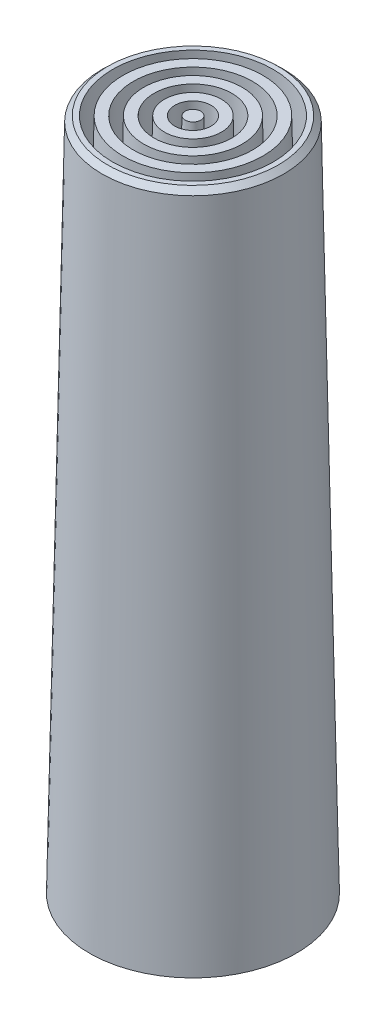
ISO-10303-21;
HEADER;
FILE_DESCRIPTION(('STEP AP214'),'2;1');
FILE_NAME('part.step','',(''),(''),'','','');
FILE_SCHEMA(('AUTOMOTIVE_DESIGN { 1 0 10303 214 1 1 1 1 }'));
ENDSEC;
DATA;
#1=APPLICATION_CONTEXT('core data for automotive mechanical design processes');
#2=APPLICATION_PROTOCOL_DEFINITION('international standard','automotive_design',2000,#1);
#3=PRODUCT_CONTEXT('',#1,'mechanical');
#4=PRODUCT('Part','Part','',(#3));
#5=PRODUCT_RELATED_PRODUCT_CATEGORY('part','',(#4));
#6=PRODUCT_DEFINITION_FORMATION('','',#4);
#7=PRODUCT_DEFINITION_CONTEXT('part definition',#1,'design');
#8=PRODUCT_DEFINITION('design','',#6,#7);
#9=PRODUCT_DEFINITION_SHAPE('','',#8);
#10=(LENGTH_UNIT() NAMED_UNIT(*) SI_UNIT(.MILLI.,.METRE.));
#11=(NAMED_UNIT(*) PLANE_ANGLE_UNIT() SI_UNIT($,.RADIAN.));
#12=(NAMED_UNIT(*) SI_UNIT($,.STERADIAN.) SOLID_ANGLE_UNIT());
#13=UNCERTAINTY_MEASURE_WITH_UNIT(LENGTH_MEASURE(1.E-05),#10,'distance_accuracy_value','');
#14=(GEOMETRIC_REPRESENTATION_CONTEXT(3) GLOBAL_UNCERTAINTY_ASSIGNED_CONTEXT((#13)) GLOBAL_UNIT_ASSIGNED_CONTEXT((#10,
#11,#12)) REPRESENTATION_CONTEXT('',''));
#15=CARTESIAN_POINT('',(0.,0.,0.));
#16=DIRECTION('',(0.,0.,1.));
#17=DIRECTION('',(1.,0.,0.));
#18=AXIS2_PLACEMENT_3D('',#15,#16,#17);
#19=CARTESIAN_POINT('',(0.,0.,0.));
#20=DIRECTION('',(0.,1.,0.));
#21=DIRECTION('',(-1.,0.,0.));
#22=AXIS2_PLACEMENT_3D('',#19,#20,#21);
#23=PLANE('',#22);
#24=CARTESIAN_POINT('',(0.,0.,0.));
#25=DIRECTION('',(0.,1.,0.));
#26=DIRECTION('',(-1.,0.,0.));
#27=AXIS2_PLACEMENT_3D('',#24,#25,#26);
#28=CIRCLE('',#27,20.);
#29=CARTESIAN_POINT('',(-20.,0.,0.));
#30=VERTEX_POINT('',#29);
#31=EDGE_CURVE('E62',#30,#30,#28,.T.);
#32=ORIENTED_EDGE('',*,*,#31,.F.);
#33=EDGE_LOOP('',(#32));
#34=FACE_BOUND('',#33,.T.);
#35=CARTESIAN_POINT('',(0.,0.,0.));
#36=DIRECTION('',(0.,-1.,0.));
#37=DIRECTION('',(1.,0.,0.));
#38=AXIS2_PLACEMENT_3D('',#35,#36,#37);
#39=CIRCLE('',#38,17.9996302117006);
#40=CARTESIAN_POINT('',(17.9996302117006,0.,0.));
#41=VERTEX_POINT('',#40);
#42=EDGE_CURVE('E58',#41,#41,#39,.T.);
#43=ORIENTED_EDGE('',*,*,#42,.F.);
#44=EDGE_LOOP('',(#43));
#45=FACE_BOUND('',#44,.T.);
#46=ADVANCED_FACE('F46',(#34,#45),#23,.F.);
#47=CARTESIAN_POINT('',(17.5,130.,0.));
#48=DIRECTION('',(0.,-1.,0.));
#49=DIRECTION('',(1.,0.,0.));
#50=AXIS2_PLACEMENT_3D('',#47,#48,#49);
#51=PLANE('',#50);
#52=CARTESIAN_POINT('',(0.,130.,0.));
#53=DIRECTION('',(0.,-1.,0.));
#54=DIRECTION('',(1.,0.,0.));
#55=AXIS2_PLACEMENT_3D('',#52,#53,#54);
#56=CIRCLE('',#55,16.4802036373375);
#57=CARTESIAN_POINT('',(16.4802036373375,130.,0.));
#58=VERTEX_POINT('',#57);
#59=EDGE_CURVE('E54',#58,#58,#56,.F.);
#60=ORIENTED_EDGE('',*,*,#59,.T.);
#61=EDGE_LOOP('',(#60));
#62=FACE_BOUND('',#61,.T.);
#63=CARTESIAN_POINT('',(0.,130.,0.));
#64=DIRECTION('',(0.,-1.,0.));
#65=DIRECTION('',(1.,0.,0.));
#66=AXIS2_PLACEMENT_3D('',#63,#64,#65);
#67=CIRCLE('',#66,15.4996302117006);
#68=CARTESIAN_POINT('',(15.4996302117006,130.,0.));
#69=VERTEX_POINT('',#68);
#70=EDGE_CURVE('E65',#69,#69,#67,.T.);
#71=ORIENTED_EDGE('',*,*,#70,.T.);
#72=EDGE_LOOP('',(#71));
#73=FACE_BOUND('',#72,.T.);
#74=ADVANCED_FACE('F75',(#62,#73),#51,.F.);
#75=CARTESIAN_POINT('',(0.,0.,0.));
#76=DIRECTION('',(0.,-1.,0.));
#77=DIRECTION('',(1.,0.,0.));
#78=AXIS2_PLACEMENT_3D('',#75,#76,#77);
#79=CONICAL_SURFACE('',#78,20.,0.0192283990997072);
#80=CARTESIAN_POINT('',(0.,129.00018485997,0.));
#81=DIRECTION('',(0.,1.,0.));
#82=DIRECTION('',(-1.,0.,0.));
#83=AXIS2_PLACEMENT_3D('',#80,#81,#82);
#84=CIRCLE('',#83,17.5192272142313);
#85=CARTESIAN_POINT('',(-17.5192272142313,129.00018485997,0.));
#86=VERTEX_POINT('',#85);
#87=EDGE_CURVE('E11',#86,#86,#84,.F.);
#88=ORIENTED_EDGE('',*,*,#87,.T.);
#89=EDGE_LOOP('',(#88));
#90=FACE_BOUND('',#89,.T.);
#91=ORIENTED_EDGE('',*,*,#31,.T.);
#92=EDGE_LOOP('',(#91));
#93=FACE_BOUND('',#92,.T.);
#94=ADVANCED_FACE('F71',(#90,#93),#79,.T.);
#95=CARTESIAN_POINT('',(0.,0.,0.));
#96=DIRECTION('',(0.,-1.,0.));
#97=DIRECTION('',(1.,0.,0.));
#98=AXIS2_PLACEMENT_3D('',#95,#96,#97);
#99=CONICAL_SURFACE('',#98,17.9996302117006,0.0192283990997072);
#100=ORIENTED_EDGE('',*,*,#70,.F.);
#101=EDGE_LOOP('',(#100));
#102=FACE_BOUND('',#101,.T.);
#103=ORIENTED_EDGE('',*,*,#42,.T.);
#104=EDGE_LOOP('',(#103));
#105=FACE_BOUND('',#104,.T.);
#106=ADVANCED_FACE('F78',(#102,#105),#99,.F.);
#107=CARTESIAN_POINT('',(0.,130.,0.));
#108=DIRECTION('',(0.,-1.,0.));
#109=DIRECTION('',(1.,0.,0.));
#110=AXIS2_PLACEMENT_3D('',#107,#108,#109);
#111=CONICAL_SURFACE('',#110,16.4802036373375,0.804626562497172);
#112=ORIENTED_EDGE('',*,*,#87,.F.);
#113=EDGE_LOOP('',(#112));
#114=FACE_BOUND('',#113,.T.);
#115=ORIENTED_EDGE('',*,*,#59,.F.);
#116=EDGE_LOOP('',(#115));
#117=FACE_BOUND('',#116,.T.);
#118=ADVANCED_FACE('F49',(#114,#117),#111,.T.);
#119=CLOSED_SHELL('',(#46,#74,#94,#106,#118));
#120=MANIFOLD_SOLID_BREP('B2',#119);
#121=CARTESIAN_POINT('',(17.5,130.,0.));
#122=DIRECTION('',(0.,-1.,0.));
#123=DIRECTION('',(1.,0.,0.));
#124=AXIS2_PLACEMENT_3D('',#121,#122,#123);
#125=PLANE('',#124);
#126=CARTESIAN_POINT('',(0.,130.,0.));
#127=DIRECTION('',(0.,-1.,0.));
#128=DIRECTION('',(1.,0.,0.));
#129=AXIS2_PLACEMENT_3D('',#126,#127,#128);
#130=CIRCLE('',#129,13.4992604234013);
#131=CARTESIAN_POINT('',(13.4992604234013,130.,0.));
#132=VERTEX_POINT('',#131);
#133=EDGE_CURVE('E156',#132,#132,#130,.T.);
#134=ORIENTED_EDGE('',*,*,#133,.F.);
#135=EDGE_LOOP('',(#134));
#136=FACE_BOUND('',#135,.T.);
#137=CARTESIAN_POINT('',(0.,130.,0.));
#138=DIRECTION('',(0.,-1.,0.));
#139=DIRECTION('',(1.,0.,0.));
#140=AXIS2_PLACEMENT_3D('',#137,#138,#139);
#141=CIRCLE('',#140,11.4988906351019);
#142=CARTESIAN_POINT('',(11.4988906351019,130.,0.));
#143=VERTEX_POINT('',#142);
#144=EDGE_CURVE('E158',#143,#143,#141,.T.);
#145=ORIENTED_EDGE('',*,*,#144,.T.);
#146=EDGE_LOOP('',(#145));
#147=FACE_BOUND('',#146,.T.);
#148=ADVANCED_FACE('F144',(#136,#147),#125,.F.);
#149=CARTESIAN_POINT('',(0.,130.,0.));
#150=DIRECTION('',(0.,-1.,0.));
#151=DIRECTION('',(1.,0.,0.));
#152=AXIS2_PLACEMENT_3D('',#149,#150,#151);
#153=CONICAL_SURFACE('',#152,13.4992604234013,0.0192283990997072);
#154=CARTESIAN_POINT('',(0.,0.,0.));
#155=DIRECTION('',(0.,-1.,0.));
#156=DIRECTION('',(1.,0.,0.));
#157=AXIS2_PLACEMENT_3D('',#154,#155,#156);
#158=CIRCLE('',#157,15.9992604234013);
#159=CARTESIAN_POINT('',(15.9992604234013,0.,0.));
#160=VERTEX_POINT('',#159);
#161=EDGE_CURVE('E45',#160,#160,#158,.T.);
#162=ORIENTED_EDGE('',*,*,#161,.F.);
#163=EDGE_LOOP('',(#162));
#164=FACE_BOUND('',#163,.T.);
#165=ORIENTED_EDGE('',*,*,#133,.T.);
#166=EDGE_LOOP('',(#165));
#167=FACE_BOUND('',#166,.T.);
#168=ADVANCED_FACE('F165',(#164,#167),#153,.T.);
#169=CARTESIAN_POINT('',(0.,0.,0.));
#170=DIRECTION('',(0.,-1.,0.));
#171=DIRECTION('',(1.,0.,0.));
#172=AXIS2_PLACEMENT_3D('',#169,#170,#171);
#173=CONICAL_SURFACE('',#172,13.9988906351019,0.0192283990997072);
#174=ORIENTED_EDGE('',*,*,#144,.F.);
#175=EDGE_LOOP('',(#174));
#176=FACE_BOUND('',#175,.T.);
#177=CARTESIAN_POINT('',(0.,0.,0.));
#178=DIRECTION('',(0.,-1.,0.));
#179=DIRECTION('',(1.,0.,0.));
#180=AXIS2_PLACEMENT_3D('',#177,#178,#179);
#181=CIRCLE('',#180,13.9988906351019);
#182=CARTESIAN_POINT('',(13.9988906351019,0.,0.));
#183=VERTEX_POINT('',#182);
#184=EDGE_CURVE('E148',#183,#183,#181,.T.);
#185=ORIENTED_EDGE('',*,*,#184,.T.);
#186=EDGE_LOOP('',(#185));
#187=FACE_BOUND('',#186,.T.);
#188=ADVANCED_FACE('F171',(#176,#187),#173,.F.);
#189=CARTESIAN_POINT('',(0.,0.,0.));
#190=DIRECTION('',(0.,1.,0.));
#191=DIRECTION('',(-1.,0.,0.));
#192=AXIS2_PLACEMENT_3D('',#189,#190,#191);
#193=PLANE('',#192);
#194=ORIENTED_EDGE('',*,*,#161,.T.);
#195=EDGE_LOOP('',(#194));
#196=FACE_BOUND('',#195,.T.);
#197=ORIENTED_EDGE('',*,*,#184,.F.);
#198=EDGE_LOOP('',(#197));
#199=FACE_BOUND('',#198,.T.);
#200=ADVANCED_FACE('F146',(#196,#199),#193,.F.);
#201=CLOSED_SHELL('',(#148,#168,#188,#200));
#202=MANIFOLD_SOLID_BREP('B6',#201);
#203=CARTESIAN_POINT('',(17.5,130.,0.));
#204=DIRECTION('',(0.,-1.,0.));
#205=DIRECTION('',(1.,0.,0.));
#206=AXIS2_PLACEMENT_3D('',#203,#204,#205);
#207=PLANE('',#206);
#208=CARTESIAN_POINT('',(0.,130.,0.));
#209=DIRECTION('',(0.,-1.,0.));
#210=DIRECTION('',(1.,0.,0.));
#211=AXIS2_PLACEMENT_3D('',#208,#209,#210);
#212=CIRCLE('',#211,3.49741148190448);
#213=CARTESIAN_POINT('',(3.49741148190448,130.,0.));
#214=VERTEX_POINT('',#213);
#215=EDGE_CURVE('E236',#214,#214,#212,.T.);
#216=ORIENTED_EDGE('',*,*,#215,.T.);
#217=EDGE_LOOP('',(#216));
#218=FACE_BOUND('',#217,.T.);
#219=CARTESIAN_POINT('',(0.,130.,0.));
#220=DIRECTION('',(0.,-1.,0.));
#221=DIRECTION('',(1.,0.,0.));
#222=AXIS2_PLACEMENT_3D('',#219,#220,#221);
#223=CIRCLE('',#222,5.49778127020384);
#224=CARTESIAN_POINT('',(5.49778127020384,130.,0.));
#225=VERTEX_POINT('',#224);
#226=EDGE_CURVE('E230',#225,#225,#223,.T.);
#227=ORIENTED_EDGE('',*,*,#226,.F.);
#228=EDGE_LOOP('',(#227));
#229=FACE_BOUND('',#228,.T.);
#230=ADVANCED_FACE('F222',(#218,#229),#207,.F.);
#231=CARTESIAN_POINT('',(0.,0.,0.));
#232=DIRECTION('',(0.,-1.,0.));
#233=DIRECTION('',(1.,0.,0.));
#234=AXIS2_PLACEMENT_3D('',#231,#232,#233);
#235=CONICAL_SURFACE('',#234,5.99741148190448,0.0192283990997072);
#236=ORIENTED_EDGE('',*,*,#215,.F.);
#237=EDGE_LOOP('',(#236));
#238=FACE_BOUND('',#237,.T.);
#239=CARTESIAN_POINT('',(0.,0.,0.));
#240=DIRECTION('',(0.,-1.,0.));
#241=DIRECTION('',(1.,0.,0.));
#242=AXIS2_PLACEMENT_3D('',#239,#240,#241);
#243=CIRCLE('',#242,5.99741148190448);
#244=CARTESIAN_POINT('',(5.99741148190448,0.,0.));
#245=VERTEX_POINT('',#244);
#246=EDGE_CURVE('E226',#245,#245,#243,.T.);
#247=ORIENTED_EDGE('',*,*,#246,.T.);
#248=EDGE_LOOP('',(#247));
#249=FACE_BOUND('',#248,.T.);
#250=ADVANCED_FACE('F243',(#238,#249),#235,.F.);
#251=CARTESIAN_POINT('',(0.,130.,0.));
#252=DIRECTION('',(0.,-1.,0.));
#253=DIRECTION('',(1.,0.,0.));
#254=AXIS2_PLACEMENT_3D('',#251,#252,#253);
#255=CONICAL_SURFACE('',#254,5.49778127020384,0.0192283990997072);
#256=CARTESIAN_POINT('',(0.,0.,0.));
#257=DIRECTION('',(0.,-1.,0.));
#258=DIRECTION('',(1.,0.,0.));
#259=AXIS2_PLACEMENT_3D('',#256,#257,#258);
#260=CIRCLE('',#259,7.99778127020384);
#261=CARTESIAN_POINT('',(7.99778127020384,0.,0.));
#262=VERTEX_POINT('',#261);
#263=EDGE_CURVE('E143',#262,#262,#260,.T.);
#264=ORIENTED_EDGE('',*,*,#263,.F.);
#265=EDGE_LOOP('',(#264));
#266=FACE_BOUND('',#265,.T.);
#267=ORIENTED_EDGE('',*,*,#226,.T.);
#268=EDGE_LOOP('',(#267));
#269=FACE_BOUND('',#268,.T.);
#270=ADVANCED_FACE('F246',(#266,#269),#255,.T.);
#271=CARTESIAN_POINT('',(0.,0.,0.));
#272=DIRECTION('',(0.,1.,0.));
#273=DIRECTION('',(-1.,0.,0.));
#274=AXIS2_PLACEMENT_3D('',#271,#272,#273);
#275=PLANE('',#274);
#276=ORIENTED_EDGE('',*,*,#246,.F.);
#277=EDGE_LOOP('',(#276));
#278=FACE_BOUND('',#277,.T.);
#279=ORIENTED_EDGE('',*,*,#263,.T.);
#280=EDGE_LOOP('',(#279));
#281=FACE_BOUND('',#280,.T.);
#282=ADVANCED_FACE('F224',(#278,#281),#275,.F.);
#283=CLOSED_SHELL('',(#230,#250,#270,#282));
#284=MANIFOLD_SOLID_BREP('B40',#283);
#285=CARTESIAN_POINT('',(17.5,130.,0.));
#286=DIRECTION('',(0.,-1.,0.));
#287=DIRECTION('',(1.,0.,0.));
#288=AXIS2_PLACEMENT_3D('',#285,#286,#287);
#289=PLANE('',#288);
#290=CARTESIAN_POINT('',(0.,130.,0.));
#291=DIRECTION('',(0.,-1.,0.));
#292=DIRECTION('',(1.,0.,0.));
#293=AXIS2_PLACEMENT_3D('',#290,#291,#292);
#294=CIRCLE('',#293,1.49704169360513);
#295=CARTESIAN_POINT('',(1.49704169360512,130.,0.));
#296=VERTEX_POINT('',#295);
#297=EDGE_CURVE('E303',#296,#296,#294,.T.);
#298=ORIENTED_EDGE('',*,*,#297,.F.);
#299=EDGE_LOOP('',(#298));
#300=FACE_BOUND('',#299,.T.);
#301=ADVANCED_FACE('F299',(#300),#289,.F.);
#302=CARTESIAN_POINT('',(0.,130.,0.));
#303=DIRECTION('',(0.,-1.,0.));
#304=DIRECTION('',(1.,0.,0.));
#305=AXIS2_PLACEMENT_3D('',#302,#303,#304);
#306=CONICAL_SURFACE('',#305,1.49704169360513,0.0192283990997072);
#307=CARTESIAN_POINT('',(0.,0.,0.));
#308=DIRECTION('',(0.,-1.,0.));
#309=DIRECTION('',(1.,0.,0.));
#310=AXIS2_PLACEMENT_3D('',#307,#308,#309);
#311=CIRCLE('',#310,3.99704169360512);
#312=CARTESIAN_POINT('',(3.99704169360512,0.,0.));
#313=VERTEX_POINT('',#312);
#314=EDGE_CURVE('E221',#313,#313,#311,.T.);
#315=ORIENTED_EDGE('',*,*,#314,.F.);
#316=EDGE_LOOP('',(#315));
#317=FACE_BOUND('',#316,.T.);
#318=ORIENTED_EDGE('',*,*,#297,.T.);
#319=EDGE_LOOP('',(#318));
#320=FACE_BOUND('',#319,.T.);
#321=ADVANCED_FACE('F312',(#317,#320),#306,.T.);
#322=CARTESIAN_POINT('',(0.,0.,0.));
#323=DIRECTION('',(0.,1.,0.));
#324=DIRECTION('',(-1.,0.,0.));
#325=AXIS2_PLACEMENT_3D('',#322,#323,#324);
#326=PLANE('',#325);
#327=ORIENTED_EDGE('',*,*,#314,.T.);
#328=EDGE_LOOP('',(#327));
#329=FACE_BOUND('',#328,.T.);
#330=ADVANCED_FACE('F301',(#329),#326,.F.);
#331=CLOSED_SHELL('',(#301,#321,#330));
#332=MANIFOLD_SOLID_BREP('B138',#331);
#333=CARTESIAN_POINT('',(17.5,130.,0.));
#334=DIRECTION('',(0.,-1.,0.));
#335=DIRECTION('',(1.,0.,0.));
#336=AXIS2_PLACEMENT_3D('',#333,#334,#335);
#337=PLANE('',#336);
#338=CARTESIAN_POINT('',(0.,130.,0.));
#339=DIRECTION('',(0.,-1.,0.));
#340=DIRECTION('',(1.,0.,0.));
#341=AXIS2_PLACEMENT_3D('',#338,#339,#340);
#342=CIRCLE('',#341,9.49852084680257);
#343=CARTESIAN_POINT('',(9.49852084680256,130.,0.));
#344=VERTEX_POINT('',#343);
#345=EDGE_CURVE('E353',#344,#344,#342,.T.);
#346=ORIENTED_EDGE('',*,*,#345,.F.);
#347=EDGE_LOOP('',(#346));
#348=FACE_BOUND('',#347,.T.);
#349=CARTESIAN_POINT('',(0.,130.,0.));
#350=DIRECTION('',(0.,-1.,0.));
#351=DIRECTION('',(1.,0.,0.));
#352=AXIS2_PLACEMENT_3D('',#349,#350,#351);
#353=CIRCLE('',#352,7.49815105850321);
#354=CARTESIAN_POINT('',(7.4981510585032,130.,0.));
#355=VERTEX_POINT('',#354);
#356=EDGE_CURVE('E357',#355,#355,#353,.T.);
#357=ORIENTED_EDGE('',*,*,#356,.T.);
#358=EDGE_LOOP('',(#357));
#359=FACE_BOUND('',#358,.T.);
#360=ADVANCED_FACE('F346',(#348,#359),#337,.F.);
#361=CARTESIAN_POINT('',(0.,130.,0.));
#362=DIRECTION('',(0.,-1.,0.));
#363=DIRECTION('',(1.,0.,0.));
#364=AXIS2_PLACEMENT_3D('',#361,#362,#363);
#365=CONICAL_SURFACE('',#364,9.49852084680257,0.0192283990997072);
#366=CARTESIAN_POINT('',(0.,0.,0.));
#367=DIRECTION('',(0.,-1.,0.));
#368=DIRECTION('',(1.,0.,0.));
#369=AXIS2_PLACEMENT_3D('',#366,#367,#368);
#370=CIRCLE('',#369,11.9985208468026);
#371=CARTESIAN_POINT('',(11.9985208468026,0.,0.));
#372=VERTEX_POINT('',#371);
#373=EDGE_CURVE('E298',#372,#372,#370,.T.);
#374=ORIENTED_EDGE('',*,*,#373,.F.);
#375=EDGE_LOOP('',(#374));
#376=FACE_BOUND('',#375,.T.);
#377=ORIENTED_EDGE('',*,*,#345,.T.);
#378=EDGE_LOOP('',(#377));
#379=FACE_BOUND('',#378,.T.);
#380=ADVANCED_FACE('F373',(#376,#379),#365,.T.);
#381=CARTESIAN_POINT('',(0.,0.,0.));
#382=DIRECTION('',(0.,-1.,0.));
#383=DIRECTION('',(1.,0.,0.));
#384=AXIS2_PLACEMENT_3D('',#381,#382,#383);
#385=CONICAL_SURFACE('',#384,9.9981510585032,0.0192283990997072);
#386=ORIENTED_EDGE('',*,*,#356,.F.);
#387=EDGE_LOOP('',(#386));
#388=FACE_BOUND('',#387,.T.);
#389=CARTESIAN_POINT('',(0.,0.,0.));
#390=DIRECTION('',(0.,-1.,0.));
#391=DIRECTION('',(1.,0.,0.));
#392=AXIS2_PLACEMENT_3D('',#389,#390,#391);
#393=CIRCLE('',#392,9.9981510585032);
#394=CARTESIAN_POINT('',(9.9981510585032,0.,0.));
#395=VERTEX_POINT('',#394);
#396=EDGE_CURVE('E361',#395,#395,#393,.T.);
#397=ORIENTED_EDGE('',*,*,#396,.T.);
#398=EDGE_LOOP('',(#397));
#399=FACE_BOUND('',#398,.T.);
#400=ADVANCED_FACE('F367',(#388,#399),#385,.F.);
#401=CARTESIAN_POINT('',(0.,0.,0.));
#402=DIRECTION('',(0.,1.,0.));
#403=DIRECTION('',(-1.,0.,0.));
#404=AXIS2_PLACEMENT_3D('',#401,#402,#403);
#405=PLANE('',#404);
#406=ORIENTED_EDGE('',*,*,#373,.T.);
#407=EDGE_LOOP('',(#406));
#408=FACE_BOUND('',#407,.T.);
#409=ORIENTED_EDGE('',*,*,#396,.F.);
#410=EDGE_LOOP('',(#409));
#411=FACE_BOUND('',#410,.T.);
#412=ADVANCED_FACE('F348',(#408,#411),#405,.F.);
#413=CLOSED_SHELL('',(#360,#380,#400,#412));
#414=MANIFOLD_SOLID_BREP('B216',#413);
#415=ADVANCED_BREP_SHAPE_REPRESENTATION('',(#18,#120,#202,#284,#332,#414),#14);
#416=SHAPE_DEFINITION_REPRESENTATION(#9,#415);
ENDSEC;
END-ISO-10303-21;
